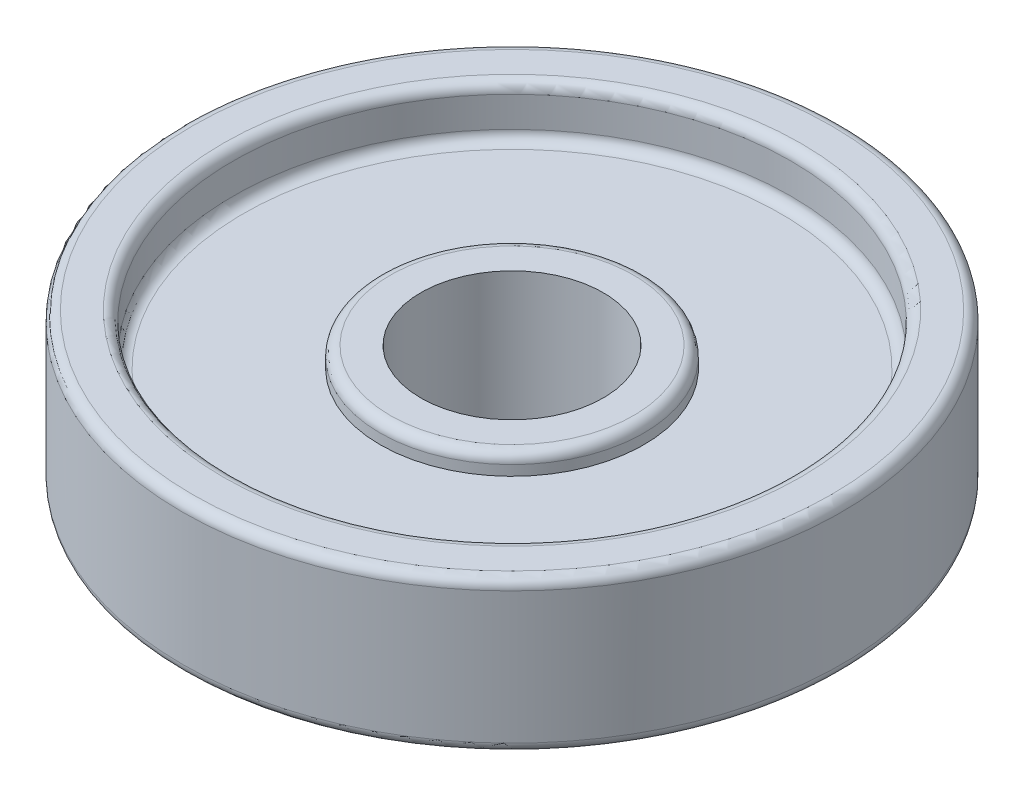
ISO-10303-21;
HEADER;
FILE_DESCRIPTION(('STEP AP214'),'2;1');
FILE_NAME('part.step','',(''),(''),'','','');
FILE_SCHEMA(('AUTOMOTIVE_DESIGN { 1 0 10303 214 1 1 1 1 }'));
ENDSEC;
DATA;
#1=APPLICATION_CONTEXT('core data for automotive mechanical design processes');
#2=APPLICATION_PROTOCOL_DEFINITION('international standard','automotive_design',2000,#1);
#3=PRODUCT_CONTEXT('',#1,'mechanical');
#4=PRODUCT('Part','Part','',(#3));
#5=PRODUCT_RELATED_PRODUCT_CATEGORY('part','',(#4));
#6=PRODUCT_DEFINITION_FORMATION('','',#4);
#7=PRODUCT_DEFINITION_CONTEXT('part definition',#1,'design');
#8=PRODUCT_DEFINITION('design','',#6,#7);
#9=PRODUCT_DEFINITION_SHAPE('','',#8);
#10=(LENGTH_UNIT() NAMED_UNIT(*) SI_UNIT(.MILLI.,.METRE.));
#11=(NAMED_UNIT(*) PLANE_ANGLE_UNIT() SI_UNIT($,.RADIAN.));
#12=(NAMED_UNIT(*) SI_UNIT($,.STERADIAN.) SOLID_ANGLE_UNIT());
#13=UNCERTAINTY_MEASURE_WITH_UNIT(LENGTH_MEASURE(1.E-05),#10,'distance_accuracy_value','');
#14=(GEOMETRIC_REPRESENTATION_CONTEXT(3) GLOBAL_UNCERTAINTY_ASSIGNED_CONTEXT((#13)) GLOBAL_UNIT_ASSIGNED_CONTEXT((#10,
#11,#12)) REPRESENTATION_CONTEXT('',''));
#15=CARTESIAN_POINT('',(0.,0.,0.));
#16=DIRECTION('',(0.,0.,1.));
#17=DIRECTION('',(1.,0.,0.));
#18=AXIS2_PLACEMENT_3D('',#15,#16,#17);
#19=CARTESIAN_POINT('',(0.,19.,0.));
#20=DIRECTION('',(0.,1.,0.));
#21=DIRECTION('',(0.,0.,1.));
#22=AXIS2_PLACEMENT_3D('',#19,#20,#21);
#23=CYLINDRICAL_SURFACE('',#22,9.);
#24=CARTESIAN_POINT('',(0.,16.,0.));
#25=DIRECTION('',(0.,1.,0.));
#26=DIRECTION('',(0.,0.,1.));
#27=AXIS2_PLACEMENT_3D('',#24,#25,#26);
#28=CIRCLE('',#27,9.);
#29=CARTESIAN_POINT('',(0.,16.,9.));
#30=VERTEX_POINT('',#29);
#31=EDGE_CURVE('E109',#30,#30,#28,.T.);
#32=ORIENTED_EDGE('',*,*,#31,.T.);
#33=EDGE_LOOP('',(#32));
#34=FACE_BOUND('',#33,.T.);
#35=CARTESIAN_POINT('',(0.,0.,0.));
#36=DIRECTION('',(0.,1.,0.));
#37=DIRECTION('',(0.,0.,1.));
#38=AXIS2_PLACEMENT_3D('',#35,#36,#37);
#39=CIRCLE('',#38,9.);
#40=CARTESIAN_POINT('',(0.,0.,9.));
#41=VERTEX_POINT('',#40);
#42=EDGE_CURVE('E121',#41,#41,#39,.T.);
#43=ORIENTED_EDGE('',*,*,#42,.F.);
#44=EDGE_LOOP('',(#43));
#45=FACE_BOUND('',#44,.T.);
#46=ADVANCED_FACE('F37',(#34,#45),#23,.F.);
#47=CARTESIAN_POINT('',(-9.,16.,0.));
#48=DIRECTION('',(0.,1.,0.));
#49=DIRECTION('',(0.,0.,1.));
#50=AXIS2_PLACEMENT_3D('',#47,#48,#49);
#51=PLANE('',#50);
#52=CARTESIAN_POINT('',(0.,16.,0.));
#53=DIRECTION('',(0.,1.,0.));
#54=DIRECTION('',(0.,0.,1.));
#55=AXIS2_PLACEMENT_3D('',#52,#53,#54);
#56=CIRCLE('',#55,12.);
#57=CARTESIAN_POINT('',(0.,16.,12.));
#58=VERTEX_POINT('',#57);
#59=EDGE_CURVE('E50',#58,#58,#56,.T.);
#60=ORIENTED_EDGE('',*,*,#59,.T.);
#61=EDGE_LOOP('',(#60));
#62=FACE_BOUND('',#61,.T.);
#63=ORIENTED_EDGE('',*,*,#31,.F.);
#64=EDGE_LOOP('',(#63));
#65=FACE_BOUND('',#64,.T.);
#66=ADVANCED_FACE('F129',(#62,#65),#51,.T.);
#67=CARTESIAN_POINT('',(0.,19.,0.));
#68=DIRECTION('',(0.,1.,0.));
#69=DIRECTION('',(0.,0.,1.));
#70=AXIS2_PLACEMENT_3D('',#67,#68,#69);
#71=CYLINDRICAL_SURFACE('',#70,13.);
#72=CARTESIAN_POINT('',(0.,15.,0.));
#73=DIRECTION('',(0.,1.,0.));
#74=DIRECTION('',(0.,0.,1.));
#75=AXIS2_PLACEMENT_3D('',#72,#73,#74);
#76=CIRCLE('',#75,13.);
#77=CARTESIAN_POINT('',(0.,15.,13.));
#78=VERTEX_POINT('',#77);
#79=EDGE_CURVE('E45',#78,#78,#76,.F.);
#80=ORIENTED_EDGE('',*,*,#79,.T.);
#81=EDGE_LOOP('',(#80));
#82=FACE_BOUND('',#81,.T.);
#83=CARTESIAN_POINT('',(0.,14.,0.));
#84=DIRECTION('',(0.,1.,0.));
#85=DIRECTION('',(0.,0.,1.));
#86=AXIS2_PLACEMENT_3D('',#83,#84,#85);
#87=CIRCLE('',#86,13.);
#88=CARTESIAN_POINT('',(0.,14.,13.));
#89=VERTEX_POINT('',#88);
#90=EDGE_CURVE('E113',#89,#89,#87,.T.);
#91=ORIENTED_EDGE('',*,*,#90,.T.);
#92=EDGE_LOOP('',(#91));
#93=FACE_BOUND('',#92,.T.);
#94=ADVANCED_FACE('F135',(#82,#93),#71,.T.);
#95=CARTESIAN_POINT('',(-13.,14.,0.));
#96=DIRECTION('',(0.,1.,0.));
#97=DIRECTION('',(0.,0.,1.));
#98=AXIS2_PLACEMENT_3D('',#95,#96,#97);
#99=PLANE('',#98);
#100=CARTESIAN_POINT('',(0.,14.,0.));
#101=DIRECTION('',(0.,1.,0.));
#102=DIRECTION('',(0.,0.,1.));
#103=AXIS2_PLACEMENT_3D('',#100,#101,#102);
#104=CIRCLE('',#103,26.5);
#105=CARTESIAN_POINT('',(0.,14.,26.5));
#106=VERTEX_POINT('',#105);
#107=EDGE_CURVE('E10',#106,#106,#104,.T.);
#108=ORIENTED_EDGE('',*,*,#107,.T.);
#109=EDGE_LOOP('',(#108));
#110=FACE_BOUND('',#109,.T.);
#111=ORIENTED_EDGE('',*,*,#90,.F.);
#112=EDGE_LOOP('',(#111));
#113=FACE_BOUND('',#112,.T.);
#114=ADVANCED_FACE('F182',(#110,#113),#99,.T.);
#115=CARTESIAN_POINT('',(0.,19.,0.));
#116=DIRECTION('',(0.,1.,0.));
#117=DIRECTION('',(0.,0.,1.));
#118=AXIS2_PLACEMENT_3D('',#115,#116,#117);
#119=CYLINDRICAL_SURFACE('',#118,27.5);
#120=CARTESIAN_POINT('',(0.,18.,0.));
#121=DIRECTION('',(0.,1.,0.));
#122=DIRECTION('',(0.,0.,1.));
#123=AXIS2_PLACEMENT_3D('',#120,#121,#122);
#124=CIRCLE('',#123,27.5);
#125=CARTESIAN_POINT('',(0.,18.,27.5));
#126=VERTEX_POINT('',#125);
#127=EDGE_CURVE('E101',#126,#126,#124,.T.);
#128=ORIENTED_EDGE('',*,*,#127,.T.);
#129=EDGE_LOOP('',(#128));
#130=FACE_BOUND('',#129,.T.);
#131=CARTESIAN_POINT('',(0.,15.,0.));
#132=DIRECTION('',(0.,1.,0.));
#133=DIRECTION('',(0.,0.,1.));
#134=AXIS2_PLACEMENT_3D('',#131,#132,#133);
#135=CIRCLE('',#134,27.5);
#136=CARTESIAN_POINT('',(0.,15.,27.5));
#137=VERTEX_POINT('',#136);
#138=EDGE_CURVE('E105',#137,#137,#135,.F.);
#139=ORIENTED_EDGE('',*,*,#138,.T.);
#140=EDGE_LOOP('',(#139));
#141=FACE_BOUND('',#140,.T.);
#142=ADVANCED_FACE('F179',(#130,#141),#119,.F.);
#143=CARTESIAN_POINT('',(-27.5,19.,0.));
#144=DIRECTION('',(0.,1.,0.));
#145=DIRECTION('',(0.,0.,1.));
#146=AXIS2_PLACEMENT_3D('',#143,#144,#145);
#147=PLANE('',#146);
#148=CARTESIAN_POINT('',(0.,19.,0.));
#149=DIRECTION('',(0.,1.,0.));
#150=DIRECTION('',(0.,0.,1.));
#151=AXIS2_PLACEMENT_3D('',#148,#149,#150);
#152=CIRCLE('',#151,28.5);
#153=CARTESIAN_POINT('',(0.,19.,28.5));
#154=VERTEX_POINT('',#153);
#155=EDGE_CURVE('E93',#154,#154,#152,.F.);
#156=ORIENTED_EDGE('',*,*,#155,.T.);
#157=EDGE_LOOP('',(#156));
#158=FACE_BOUND('',#157,.T.);
#159=CARTESIAN_POINT('',(0.,19.,0.));
#160=DIRECTION('',(0.,1.,0.));
#161=DIRECTION('',(0.,0.,1.));
#162=AXIS2_PLACEMENT_3D('',#159,#160,#161);
#163=CIRCLE('',#162,31.5);
#164=CARTESIAN_POINT('',(0.,19.,31.5));
#165=VERTEX_POINT('',#164);
#166=EDGE_CURVE('E97',#165,#165,#163,.T.);
#167=ORIENTED_EDGE('',*,*,#166,.T.);
#168=EDGE_LOOP('',(#167));
#169=FACE_BOUND('',#168,.T.);
#170=ADVANCED_FACE('F181',(#158,#169),#147,.T.);
#171=CARTESIAN_POINT('',(0.,19.,0.));
#172=DIRECTION('',(0.,1.,0.));
#173=DIRECTION('',(0.,0.,1.));
#174=AXIS2_PLACEMENT_3D('',#171,#172,#173);
#175=CYLINDRICAL_SURFACE('',#174,32.5);
#176=CARTESIAN_POINT('',(0.,18.,0.));
#177=DIRECTION('',(0.,1.,0.));
#178=DIRECTION('',(0.,0.,1.));
#179=AXIS2_PLACEMENT_3D('',#176,#177,#178);
#180=CIRCLE('',#179,32.5);
#181=CARTESIAN_POINT('',(0.,18.,32.5));
#182=VERTEX_POINT('',#181);
#183=EDGE_CURVE('E85',#182,#182,#180,.F.);
#184=ORIENTED_EDGE('',*,*,#183,.T.);
#185=EDGE_LOOP('',(#184));
#186=FACE_BOUND('',#185,.T.);
#187=CARTESIAN_POINT('',(0.,5.,0.));
#188=DIRECTION('',(0.,-1.,0.));
#189=DIRECTION('',(0.,0.,-1.));
#190=AXIS2_PLACEMENT_3D('',#187,#188,#189);
#191=CIRCLE('',#190,32.5);
#192=CARTESIAN_POINT('',(0.,5.,-32.5));
#193=VERTEX_POINT('',#192);
#194=EDGE_CURVE('E89',#193,#193,#191,.F.);
#195=ORIENTED_EDGE('',*,*,#194,.T.);
#196=EDGE_LOOP('',(#195));
#197=FACE_BOUND('',#196,.T.);
#198=ADVANCED_FACE('F189',(#186,#197),#175,.T.);
#199=CARTESIAN_POINT('',(-32.5,4.,0.));
#200=DIRECTION('',(0.,-1.,0.));
#201=DIRECTION('',(0.,0.,-1.));
#202=AXIS2_PLACEMENT_3D('',#199,#200,#201);
#203=PLANE('',#202);
#204=CARTESIAN_POINT('',(0.,4.,0.));
#205=DIRECTION('',(0.,-1.,0.));
#206=DIRECTION('',(0.,0.,-1.));
#207=AXIS2_PLACEMENT_3D('',#204,#205,#206);
#208=CIRCLE('',#207,31.5);
#209=CARTESIAN_POINT('',(0.,4.,-31.5));
#210=VERTEX_POINT('',#209);
#211=EDGE_CURVE('E77',#210,#210,#208,.T.);
#212=ORIENTED_EDGE('',*,*,#211,.T.);
#213=EDGE_LOOP('',(#212));
#214=FACE_BOUND('',#213,.T.);
#215=CARTESIAN_POINT('',(0.,4.,0.));
#216=DIRECTION('',(0.,-1.,0.));
#217=DIRECTION('',(0.,0.,-1.));
#218=AXIS2_PLACEMENT_3D('',#215,#216,#217);
#219=CIRCLE('',#218,28.5);
#220=CARTESIAN_POINT('',(0.,4.,-28.5));
#221=VERTEX_POINT('',#220);
#222=EDGE_CURVE('E81',#221,#221,#219,.F.);
#223=ORIENTED_EDGE('',*,*,#222,.T.);
#224=EDGE_LOOP('',(#223));
#225=FACE_BOUND('',#224,.T.);
#226=ADVANCED_FACE('F225',(#214,#225),#203,.T.);
#227=CARTESIAN_POINT('',(0.,19.,0.));
#228=DIRECTION('',(0.,1.,0.));
#229=DIRECTION('',(0.,0.,1.));
#230=AXIS2_PLACEMENT_3D('',#227,#228,#229);
#231=CYLINDRICAL_SURFACE('',#230,27.5);
#232=CARTESIAN_POINT('',(0.,5.,0.));
#233=DIRECTION('',(0.,-1.,0.));
#234=DIRECTION('',(0.,0.,-1.));
#235=AXIS2_PLACEMENT_3D('',#232,#233,#234);
#236=CIRCLE('',#235,27.5);
#237=CARTESIAN_POINT('',(0.,5.,-27.5));
#238=VERTEX_POINT('',#237);
#239=EDGE_CURVE('E69',#238,#238,#236,.T.);
#240=ORIENTED_EDGE('',*,*,#239,.T.);
#241=EDGE_LOOP('',(#240));
#242=FACE_BOUND('',#241,.T.);
#243=CARTESIAN_POINT('',(0.,8.,0.));
#244=DIRECTION('',(0.,-1.,0.));
#245=DIRECTION('',(0.,0.,-1.));
#246=AXIS2_PLACEMENT_3D('',#243,#244,#245);
#247=CIRCLE('',#246,27.5);
#248=CARTESIAN_POINT('',(0.,8.,-27.5));
#249=VERTEX_POINT('',#248);
#250=EDGE_CURVE('E73',#249,#249,#247,.F.);
#251=ORIENTED_EDGE('',*,*,#250,.T.);
#252=EDGE_LOOP('',(#251));
#253=FACE_BOUND('',#252,.T.);
#254=ADVANCED_FACE('F234',(#242,#253),#231,.F.);
#255=CARTESIAN_POINT('',(-27.5,9.,0.));
#256=DIRECTION('',(0.,-1.,0.));
#257=DIRECTION('',(0.,0.,-1.));
#258=AXIS2_PLACEMENT_3D('',#255,#256,#257);
#259=PLANE('',#258);
#260=CARTESIAN_POINT('',(0.,9.,0.));
#261=DIRECTION('',(0.,-1.,0.));
#262=DIRECTION('',(0.,0.,-1.));
#263=AXIS2_PLACEMENT_3D('',#260,#261,#262);
#264=CIRCLE('',#263,26.5);
#265=CARTESIAN_POINT('',(0.,9.,-26.5));
#266=VERTEX_POINT('',#265);
#267=EDGE_CURVE('E55',#266,#266,#264,.T.);
#268=ORIENTED_EDGE('',*,*,#267,.T.);
#269=EDGE_LOOP('',(#268));
#270=FACE_BOUND('',#269,.T.);
#271=CARTESIAN_POINT('',(0.,9.,0.));
#272=DIRECTION('',(0.,1.,0.));
#273=DIRECTION('',(0.,0.,1.));
#274=AXIS2_PLACEMENT_3D('',#271,#272,#273);
#275=CIRCLE('',#274,13.);
#276=CARTESIAN_POINT('',(0.,9.,13.));
#277=VERTEX_POINT('',#276);
#278=EDGE_CURVE('E117',#277,#277,#275,.T.);
#279=ORIENTED_EDGE('',*,*,#278,.T.);
#280=EDGE_LOOP('',(#279));
#281=FACE_BOUND('',#280,.T.);
#282=ADVANCED_FACE('F244',(#270,#281),#259,.T.);
#283=CARTESIAN_POINT('',(0.,19.,0.));
#284=DIRECTION('',(0.,1.,0.));
#285=DIRECTION('',(0.,0.,1.));
#286=AXIS2_PLACEMENT_3D('',#283,#284,#285);
#287=CYLINDRICAL_SURFACE('',#286,13.);
#288=CARTESIAN_POINT('',(0.,0.999999999999997,0.));
#289=DIRECTION('',(0.,-1.,0.));
#290=DIRECTION('',(0.,0.,-1.));
#291=AXIS2_PLACEMENT_3D('',#288,#289,#290);
#292=CIRCLE('',#291,13.);
#293=CARTESIAN_POINT('',(0.,0.999999999999997,-13.));
#294=VERTEX_POINT('',#293);
#295=EDGE_CURVE('E65',#294,#294,#292,.F.);
#296=ORIENTED_EDGE('',*,*,#295,.T.);
#297=EDGE_LOOP('',(#296));
#298=FACE_BOUND('',#297,.T.);
#299=ORIENTED_EDGE('',*,*,#278,.F.);
#300=EDGE_LOOP('',(#299));
#301=FACE_BOUND('',#300,.T.);
#302=ADVANCED_FACE('F254',(#298,#301),#287,.T.);
#303=CARTESIAN_POINT('',(-13.,0.,0.));
#304=DIRECTION('',(0.,-1.,0.));
#305=DIRECTION('',(0.,0.,-1.));
#306=AXIS2_PLACEMENT_3D('',#303,#304,#305);
#307=PLANE('',#306);
#308=CARTESIAN_POINT('',(0.,0.,0.));
#309=DIRECTION('',(0.,-1.,0.));
#310=DIRECTION('',(0.,0.,-1.));
#311=AXIS2_PLACEMENT_3D('',#308,#309,#310);
#312=CIRCLE('',#311,12.);
#313=CARTESIAN_POINT('',(0.,0.,-12.));
#314=VERTEX_POINT('',#313);
#315=EDGE_CURVE('E61',#314,#314,#312,.T.);
#316=ORIENTED_EDGE('',*,*,#315,.T.);
#317=EDGE_LOOP('',(#316));
#318=FACE_BOUND('',#317,.T.);
#319=ORIENTED_EDGE('',*,*,#42,.T.);
#320=EDGE_LOOP('',(#319));
#321=FACE_BOUND('',#320,.T.);
#322=ADVANCED_FACE('F126',(#318,#321),#307,.T.);
#323=CARTESIAN_POINT('',(0.,18.,0.));
#324=DIRECTION('',(0.,1.,0.));
#325=DIRECTION('',(0.,0.,1.));
#326=AXIS2_PLACEMENT_3D('',#323,#324,#325);
#327=TOROIDAL_SURFACE('',#326,28.5,1.);
#328=ORIENTED_EDGE('',*,*,#155,.F.);
#329=EDGE_LOOP('',(#328));
#330=FACE_BOUND('',#329,.T.);
#331=ORIENTED_EDGE('',*,*,#127,.F.);
#332=EDGE_LOOP('',(#331));
#333=FACE_BOUND('',#332,.T.);
#334=ADVANCED_FACE('F140',(#330,#333),#327,.T.);
#335=CARTESIAN_POINT('',(0.,18.,0.));
#336=DIRECTION('',(0.,1.,0.));
#337=DIRECTION('',(0.,0.,1.));
#338=AXIS2_PLACEMENT_3D('',#335,#336,#337);
#339=TOROIDAL_SURFACE('',#338,31.5,1.);
#340=ORIENTED_EDGE('',*,*,#183,.F.);
#341=EDGE_LOOP('',(#340));
#342=FACE_BOUND('',#341,.T.);
#343=ORIENTED_EDGE('',*,*,#166,.F.);
#344=EDGE_LOOP('',(#343));
#345=FACE_BOUND('',#344,.T.);
#346=ADVANCED_FACE('F143',(#342,#345),#339,.T.);
#347=CARTESIAN_POINT('',(0.,5.,0.));
#348=DIRECTION('',(0.,-1.,0.));
#349=DIRECTION('',(0.,0.,-1.));
#350=AXIS2_PLACEMENT_3D('',#347,#348,#349);
#351=TOROIDAL_SURFACE('',#350,31.5,1.);
#352=ORIENTED_EDGE('',*,*,#211,.F.);
#353=EDGE_LOOP('',(#352));
#354=FACE_BOUND('',#353,.T.);
#355=ORIENTED_EDGE('',*,*,#194,.F.);
#356=EDGE_LOOP('',(#355));
#357=FACE_BOUND('',#356,.T.);
#358=ADVANCED_FACE('F147',(#354,#357),#351,.T.);
#359=CARTESIAN_POINT('',(0.,5.,0.));
#360=DIRECTION('',(0.,-1.,0.));
#361=DIRECTION('',(0.,0.,-1.));
#362=AXIS2_PLACEMENT_3D('',#359,#360,#361);
#363=TOROIDAL_SURFACE('',#362,28.5,1.);
#364=ORIENTED_EDGE('',*,*,#239,.F.);
#365=EDGE_LOOP('',(#364));
#366=FACE_BOUND('',#365,.T.);
#367=ORIENTED_EDGE('',*,*,#222,.F.);
#368=EDGE_LOOP('',(#367));
#369=FACE_BOUND('',#368,.T.);
#370=ADVANCED_FACE('F151',(#366,#369),#363,.T.);
#371=CARTESIAN_POINT('',(0.,0.999999999999997,0.));
#372=DIRECTION('',(0.,-1.,0.));
#373=DIRECTION('',(0.,0.,-1.));
#374=AXIS2_PLACEMENT_3D('',#371,#372,#373);
#375=TOROIDAL_SURFACE('',#374,12.,1.);
#376=ORIENTED_EDGE('',*,*,#315,.F.);
#377=EDGE_LOOP('',(#376));
#378=FACE_BOUND('',#377,.T.);
#379=ORIENTED_EDGE('',*,*,#295,.F.);
#380=EDGE_LOOP('',(#379));
#381=FACE_BOUND('',#380,.T.);
#382=ADVANCED_FACE('F155',(#378,#381),#375,.T.);
#383=CARTESIAN_POINT('',(0.,8.,0.));
#384=DIRECTION('',(0.,-1.,0.));
#385=DIRECTION('',(0.,0.,-1.));
#386=AXIS2_PLACEMENT_3D('',#383,#384,#385);
#387=TOROIDAL_SURFACE('',#386,26.5,1.);
#388=ORIENTED_EDGE('',*,*,#267,.F.);
#389=EDGE_LOOP('',(#388));
#390=FACE_BOUND('',#389,.T.);
#391=ORIENTED_EDGE('',*,*,#250,.F.);
#392=EDGE_LOOP('',(#391));
#393=FACE_BOUND('',#392,.T.);
#394=ADVANCED_FACE('F159',(#390,#393),#387,.F.);
#395=CARTESIAN_POINT('',(0.,15.,0.));
#396=DIRECTION('',(0.,1.,0.));
#397=DIRECTION('',(0.,0.,1.));
#398=AXIS2_PLACEMENT_3D('',#395,#396,#397);
#399=TOROIDAL_SURFACE('',#398,12.,1.);
#400=ORIENTED_EDGE('',*,*,#79,.F.);
#401=EDGE_LOOP('',(#400));
#402=FACE_BOUND('',#401,.T.);
#403=ORIENTED_EDGE('',*,*,#59,.F.);
#404=EDGE_LOOP('',(#403));
#405=FACE_BOUND('',#404,.T.);
#406=ADVANCED_FACE('F162',(#402,#405),#399,.T.);
#407=CARTESIAN_POINT('',(0.,15.,0.));
#408=DIRECTION('',(0.,1.,0.));
#409=DIRECTION('',(0.,0.,1.));
#410=AXIS2_PLACEMENT_3D('',#407,#408,#409);
#411=TOROIDAL_SURFACE('',#410,26.5,1.);
#412=ORIENTED_EDGE('',*,*,#138,.F.);
#413=EDGE_LOOP('',(#412));
#414=FACE_BOUND('',#413,.T.);
#415=ORIENTED_EDGE('',*,*,#107,.F.);
#416=EDGE_LOOP('',(#415));
#417=FACE_BOUND('',#416,.T.);
#418=ADVANCED_FACE('F39',(#414,#417),#411,.F.);
#419=CLOSED_SHELL('',(#46,#66,#94,#114,#142,#170,#198,#226,#254,#282,#302,#322,#334,#346,#358,
#370,#382,#394,#406,#418));
#420=MANIFOLD_SOLID_BREP('B2',#419);
#421=ADVANCED_BREP_SHAPE_REPRESENTATION('',(#18,#420),#14);
#422=SHAPE_DEFINITION_REPRESENTATION(#9,#421);
ENDSEC;
END-ISO-10303-21;
